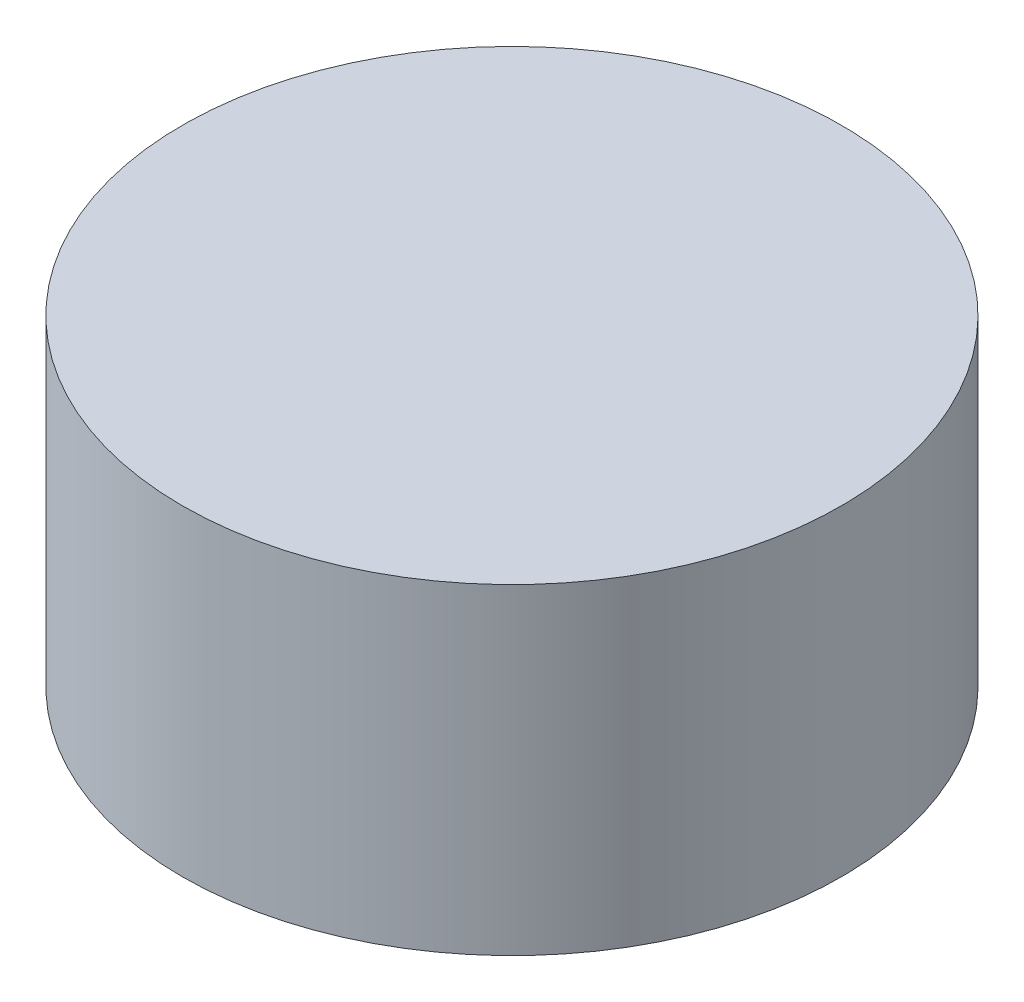
ISO-10303-21;
HEADER;
FILE_DESCRIPTION(('STEP AP214'),'2;1');
FILE_NAME('part.step','',(''),(''),'','','');
FILE_SCHEMA(('AUTOMOTIVE_DESIGN { 1 0 10303 214 1 1 1 1 }'));
ENDSEC;
DATA;
#1=APPLICATION_CONTEXT('core data for automotive mechanical design processes');
#2=APPLICATION_PROTOCOL_DEFINITION('international standard','automotive_design',2000,#1);
#3=PRODUCT_CONTEXT('',#1,'mechanical');
#4=PRODUCT('Part','Part','',(#3));
#5=PRODUCT_RELATED_PRODUCT_CATEGORY('part','',(#4));
#6=PRODUCT_DEFINITION_FORMATION('','',#4);
#7=PRODUCT_DEFINITION_CONTEXT('part definition',#1,'design');
#8=PRODUCT_DEFINITION('design','',#6,#7);
#9=PRODUCT_DEFINITION_SHAPE('','',#8);
#10=(LENGTH_UNIT() NAMED_UNIT(*) SI_UNIT(.MILLI.,.METRE.));
#11=(NAMED_UNIT(*) PLANE_ANGLE_UNIT() SI_UNIT($,.RADIAN.));
#12=(NAMED_UNIT(*) SI_UNIT($,.STERADIAN.) SOLID_ANGLE_UNIT());
#13=UNCERTAINTY_MEASURE_WITH_UNIT(LENGTH_MEASURE(1.E-05),#10,'distance_accuracy_value','');
#14=(GEOMETRIC_REPRESENTATION_CONTEXT(3) GLOBAL_UNCERTAINTY_ASSIGNED_CONTEXT((#13)) GLOBAL_UNIT_ASSIGNED_CONTEXT((#10,
#11,#12)) REPRESENTATION_CONTEXT('',''));
#15=CARTESIAN_POINT('',(0.,0.,0.));
#16=DIRECTION('',(0.,0.,1.));
#17=DIRECTION('',(1.,0.,0.));
#18=AXIS2_PLACEMENT_3D('',#15,#16,#17);
#19=CARTESIAN_POINT('',(0.,1.95,0.));
#20=DIRECTION('',(0.,-1.,0.));
#21=DIRECTION('',(0.,0.,-1.));
#22=AXIS2_PLACEMENT_3D('',#19,#20,#21);
#23=CYLINDRICAL_SURFACE('',#22,2.);
#24=CARTESIAN_POINT('',(0.,1.95,0.));
#25=DIRECTION('',(0.,1.,0.));
#26=DIRECTION('',(0.,0.,1.));
#27=AXIS2_PLACEMENT_3D('',#24,#25,#26);
#28=CIRCLE('',#27,2.);
#29=CARTESIAN_POINT('',(0.,1.95,2.));
#30=VERTEX_POINT('',#29);
#31=EDGE_CURVE('E10',#30,#30,#28,.T.);
#32=ORIENTED_EDGE('',*,*,#31,.F.);
#33=EDGE_LOOP('',(#32));
#34=FACE_BOUND('',#33,.T.);
#35=CARTESIAN_POINT('',(0.,0.,0.));
#36=DIRECTION('',(0.,1.,0.));
#37=DIRECTION('',(0.,0.,1.));
#38=AXIS2_PLACEMENT_3D('',#35,#36,#37);
#39=CIRCLE('',#38,2.);
#40=CARTESIAN_POINT('',(0.,0.,2.));
#41=VERTEX_POINT('',#40);
#42=EDGE_CURVE('E40',#41,#41,#39,.T.);
#43=ORIENTED_EDGE('',*,*,#42,.T.);
#44=EDGE_LOOP('',(#43));
#45=FACE_BOUND('',#44,.T.);
#46=ADVANCED_FACE('F37',(#34,#45),#23,.T.);
#47=CARTESIAN_POINT('',(0.,1.95,0.));
#48=DIRECTION('',(0.,1.,0.));
#49=DIRECTION('',(0.,0.,1.));
#50=AXIS2_PLACEMENT_3D('',#47,#48,#49);
#51=PLANE('',#50);
#52=ORIENTED_EDGE('',*,*,#31,.T.);
#53=EDGE_LOOP('',(#52));
#54=FACE_BOUND('',#53,.T.);
#55=ADVANCED_FACE('F54',(#54),#51,.T.);
#56=CARTESIAN_POINT('',(0.,0.,0.));
#57=DIRECTION('',(0.,1.,0.));
#58=DIRECTION('',(0.,0.,1.));
#59=AXIS2_PLACEMENT_3D('',#56,#57,#58);
#60=PLANE('',#59);
#61=ORIENTED_EDGE('',*,*,#42,.F.);
#62=EDGE_LOOP('',(#61));
#63=FACE_BOUND('',#62,.T.);
#64=ADVANCED_FACE('F52',(#63),#60,.F.);
#65=CLOSED_SHELL('',(#46,#55,#64));
#66=MANIFOLD_SOLID_BREP('B2',#65);
#67=ADVANCED_BREP_SHAPE_REPRESENTATION('',(#18,#66),#14);
#68=SHAPE_DEFINITION_REPRESENTATION(#9,#67);
ENDSEC;
END-ISO-10303-21;
